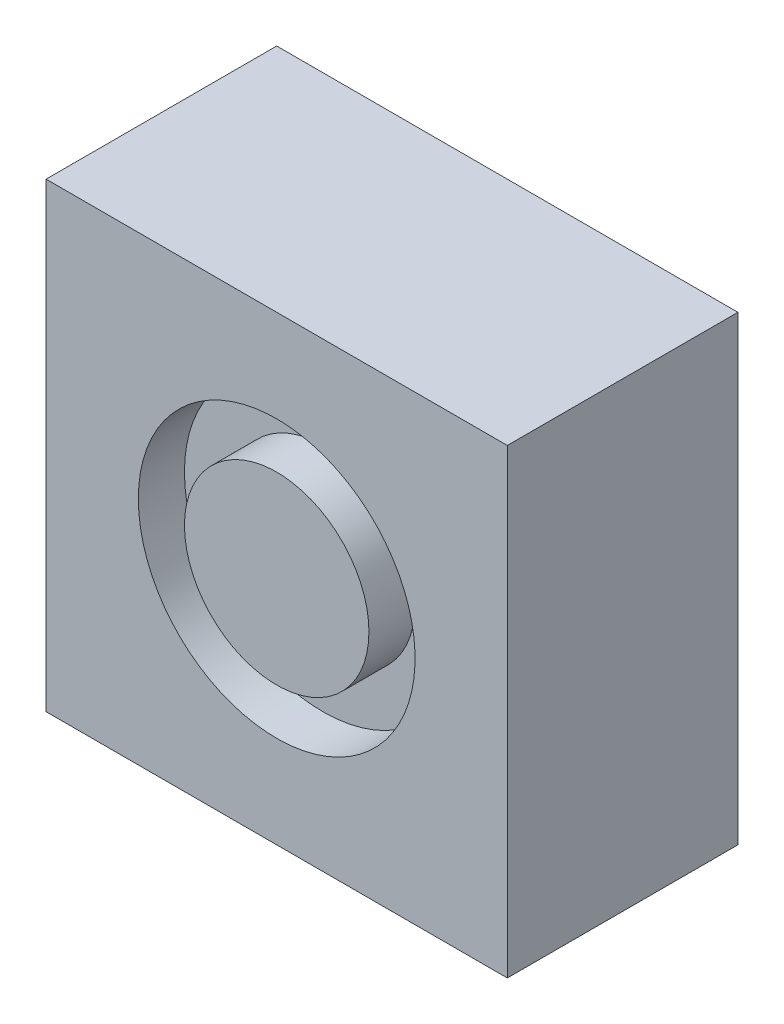
ISO-10303-21;
HEADER;
FILE_DESCRIPTION(('STEP AP214'),'2;1');
FILE_NAME('part.step','',(''),(''),'','','');
FILE_SCHEMA(('AUTOMOTIVE_DESIGN { 1 0 10303 214 1 1 1 1 }'));
ENDSEC;
DATA;
#1=APPLICATION_CONTEXT('core data for automotive mechanical design processes');
#2=APPLICATION_PROTOCOL_DEFINITION('international standard','automotive_design',2000,#1);
#3=PRODUCT_CONTEXT('',#1,'mechanical');
#4=PRODUCT('Part','Part','',(#3));
#5=PRODUCT_RELATED_PRODUCT_CATEGORY('part','',(#4));
#6=PRODUCT_DEFINITION_FORMATION('','',#4);
#7=PRODUCT_DEFINITION_CONTEXT('part definition',#1,'design');
#8=PRODUCT_DEFINITION('design','',#6,#7);
#9=PRODUCT_DEFINITION_SHAPE('','',#8);
#10=(LENGTH_UNIT() NAMED_UNIT(*) SI_UNIT(.MILLI.,.METRE.));
#11=(NAMED_UNIT(*) PLANE_ANGLE_UNIT() SI_UNIT($,.RADIAN.));
#12=(NAMED_UNIT(*) SI_UNIT($,.STERADIAN.) SOLID_ANGLE_UNIT());
#13=UNCERTAINTY_MEASURE_WITH_UNIT(LENGTH_MEASURE(1.E-05),#10,'distance_accuracy_value','');
#14=(GEOMETRIC_REPRESENTATION_CONTEXT(3) GLOBAL_UNCERTAINTY_ASSIGNED_CONTEXT((#13)) GLOBAL_UNIT_ASSIGNED_CONTEXT((#10,
#11,#12)) REPRESENTATION_CONTEXT('',''));
#15=CARTESIAN_POINT('',(0.,0.,0.));
#16=DIRECTION('',(0.,0.,1.));
#17=DIRECTION('',(1.,0.,0.));
#18=AXIS2_PLACEMENT_3D('',#15,#16,#17);
#19=CARTESIAN_POINT('',(0.,0.,50.));
#20=DIRECTION('',(0.,0.,1.));
#21=DIRECTION('',(1.,0.,0.));
#22=AXIS2_PLACEMENT_3D('',#19,#20,#21);
#23=PLANE('',#22);
#24=DIRECTION('',(0.,-1.,0.));
#25=VECTOR('',#24,1.);
#26=CARTESIAN_POINT('',(-50.,-50.,50.));
#27=LINE('',#26,#25);
#28=CARTESIAN_POINT('',(-50.,50.,50.));
#29=VERTEX_POINT('',#28);
#30=CARTESIAN_POINT('',(-50.,-50.,50.));
#31=VERTEX_POINT('',#30);
#32=EDGE_CURVE('E104',#29,#31,#27,.T.);
#33=ORIENTED_EDGE('',*,*,#32,.T.);
#34=DIRECTION('',(1.,0.,0.));
#35=VECTOR('',#34,1.);
#36=CARTESIAN_POINT('',(50.,-50.,50.));
#37=LINE('',#36,#35);
#38=CARTESIAN_POINT('',(50.,-50.,50.));
#39=VERTEX_POINT('',#38);
#40=EDGE_CURVE('E107',#31,#39,#37,.T.);
#41=ORIENTED_EDGE('',*,*,#40,.T.);
#42=DIRECTION('',(0.,1.,0.));
#43=VECTOR('',#42,1.);
#44=CARTESIAN_POINT('',(50.,-50.,50.));
#45=LINE('',#44,#43);
#46=CARTESIAN_POINT('',(50.,50.,50.));
#47=VERTEX_POINT('',#46);
#48=EDGE_CURVE('E110',#39,#47,#45,.T.);
#49=ORIENTED_EDGE('',*,*,#48,.T.);
#50=DIRECTION('',(-1.,0.,0.));
#51=VECTOR('',#50,1.);
#52=CARTESIAN_POINT('',(50.,50.,50.));
#53=LINE('',#52,#51);
#54=EDGE_CURVE('E112',#47,#29,#53,.T.);
#55=ORIENTED_EDGE('',*,*,#54,.T.);
#56=EDGE_LOOP('',(#33,#41,#49,#55));
#57=FACE_BOUND('',#56,.T.);
#58=CARTESIAN_POINT('',(0.,0.,50.));
#59=DIRECTION('',(0.,0.,1.));
#60=DIRECTION('',(1.,0.,0.));
#61=AXIS2_PLACEMENT_3D('',#58,#59,#60);
#62=CIRCLE('',#61,30.);
#63=CARTESIAN_POINT('',(-30.,0.,50.));
#64=VERTEX_POINT('',#63);
#65=EDGE_CURVE('E11',#64,#64,#62,.F.);
#66=ORIENTED_EDGE('',*,*,#65,.T.);
#67=EDGE_LOOP('',(#66));
#68=FACE_BOUND('',#67,.T.);
#69=ADVANCED_FACE('F37',(#57,#68),#23,.T.);
#70=CARTESIAN_POINT('',(-50.,-50.,50.));
#71=DIRECTION('',(1.,0.,0.));
#72=DIRECTION('',(0.,0.,-1.));
#73=AXIS2_PLACEMENT_3D('',#70,#71,#72);
#74=PLANE('',#73);
#75=DIRECTION('',(0.,-1.,0.));
#76=VECTOR('',#75,1.);
#77=CARTESIAN_POINT('',(-50.,-50.,0.));
#78=LINE('',#77,#76);
#79=CARTESIAN_POINT('',(-50.,50.,0.));
#80=VERTEX_POINT('',#79);
#81=CARTESIAN_POINT('',(-50.,-50.,0.));
#82=VERTEX_POINT('',#81);
#83=EDGE_CURVE('E99',#80,#82,#78,.T.);
#84=ORIENTED_EDGE('',*,*,#83,.T.);
#85=DIRECTION('',(0.,0.,-1.));
#86=VECTOR('',#85,1.);
#87=CARTESIAN_POINT('',(-50.,-50.,50.));
#88=LINE('',#87,#86);
#89=EDGE_CURVE('E130',#31,#82,#88,.T.);
#90=ORIENTED_EDGE('',*,*,#89,.F.);
#91=ORIENTED_EDGE('',*,*,#32,.F.);
#92=DIRECTION('',(0.,0.,-1.));
#93=VECTOR('',#92,1.);
#94=CARTESIAN_POINT('',(-50.,50.,50.));
#95=LINE('',#94,#93);
#96=EDGE_CURVE('E114',#29,#80,#95,.T.);
#97=ORIENTED_EDGE('',*,*,#96,.T.);
#98=EDGE_LOOP('',(#84,#90,#91,#97));
#99=FACE_BOUND('',#98,.T.);
#100=ADVANCED_FACE('F39',(#99),#74,.F.);
#101=CARTESIAN_POINT('',(50.,-50.,50.));
#102=DIRECTION('',(0.,1.,0.));
#103=DIRECTION('',(-1.,0.,0.));
#104=AXIS2_PLACEMENT_3D('',#101,#102,#103);
#105=PLANE('',#104);
#106=DIRECTION('',(1.,0.,0.));
#107=VECTOR('',#106,1.);
#108=CARTESIAN_POINT('',(50.,-50.,0.));
#109=LINE('',#108,#107);
#110=CARTESIAN_POINT('',(50.,-50.,0.));
#111=VERTEX_POINT('',#110);
#112=EDGE_CURVE('E117',#82,#111,#109,.T.);
#113=ORIENTED_EDGE('',*,*,#112,.T.);
#114=DIRECTION('',(0.,0.,-1.));
#115=VECTOR('',#114,1.);
#116=CARTESIAN_POINT('',(50.,-50.,50.));
#117=LINE('',#116,#115);
#118=EDGE_CURVE('E127',#39,#111,#117,.T.);
#119=ORIENTED_EDGE('',*,*,#118,.F.);
#120=ORIENTED_EDGE('',*,*,#40,.F.);
#121=ORIENTED_EDGE('',*,*,#89,.T.);
#122=EDGE_LOOP('',(#113,#119,#120,#121));
#123=FACE_BOUND('',#122,.T.);
#124=ADVANCED_FACE('F151',(#123),#105,.F.);
#125=CARTESIAN_POINT('',(50.,-50.,50.));
#126=DIRECTION('',(-1.,0.,0.));
#127=DIRECTION('',(0.,0.,1.));
#128=AXIS2_PLACEMENT_3D('',#125,#126,#127);
#129=PLANE('',#128);
#130=DIRECTION('',(0.,1.,0.));
#131=VECTOR('',#130,1.);
#132=CARTESIAN_POINT('',(50.,-50.,0.));
#133=LINE('',#132,#131);
#134=CARTESIAN_POINT('',(50.,50.,0.));
#135=VERTEX_POINT('',#134);
#136=EDGE_CURVE('E119',#111,#135,#133,.T.);
#137=ORIENTED_EDGE('',*,*,#136,.T.);
#138=DIRECTION('',(0.,0.,-1.));
#139=VECTOR('',#138,1.);
#140=CARTESIAN_POINT('',(50.,50.,50.));
#141=LINE('',#140,#139);
#142=EDGE_CURVE('E124',#47,#135,#141,.T.);
#143=ORIENTED_EDGE('',*,*,#142,.F.);
#144=ORIENTED_EDGE('',*,*,#48,.F.);
#145=ORIENTED_EDGE('',*,*,#118,.T.);
#146=EDGE_LOOP('',(#137,#143,#144,#145));
#147=FACE_BOUND('',#146,.T.);
#148=ADVANCED_FACE('F194',(#147),#129,.F.);
#149=CARTESIAN_POINT('',(50.,50.,50.));
#150=DIRECTION('',(0.,-1.,0.));
#151=DIRECTION('',(1.,0.,0.));
#152=AXIS2_PLACEMENT_3D('',#149,#150,#151);
#153=PLANE('',#152);
#154=DIRECTION('',(-1.,0.,0.));
#155=VECTOR('',#154,1.);
#156=CARTESIAN_POINT('',(50.,50.,0.));
#157=LINE('',#156,#155);
#158=EDGE_CURVE('E108',#135,#80,#157,.T.);
#159=ORIENTED_EDGE('',*,*,#158,.T.);
#160=ORIENTED_EDGE('',*,*,#96,.F.);
#161=ORIENTED_EDGE('',*,*,#54,.F.);
#162=ORIENTED_EDGE('',*,*,#142,.T.);
#163=EDGE_LOOP('',(#159,#160,#161,#162));
#164=FACE_BOUND('',#163,.T.);
#165=ADVANCED_FACE('F185',(#164),#153,.F.);
#166=CARTESIAN_POINT('',(0.,0.,0.));
#167=DIRECTION('',(0.,0.,1.));
#168=DIRECTION('',(1.,0.,0.));
#169=AXIS2_PLACEMENT_3D('',#166,#167,#168);
#170=PLANE('',#169);
#171=ORIENTED_EDGE('',*,*,#83,.F.);
#172=ORIENTED_EDGE('',*,*,#158,.F.);
#173=ORIENTED_EDGE('',*,*,#136,.F.);
#174=ORIENTED_EDGE('',*,*,#112,.F.);
#175=EDGE_LOOP('',(#171,#172,#173,#174));
#176=FACE_BOUND('',#175,.T.);
#177=ADVANCED_FACE('F143',(#176),#170,.F.);
#178=CARTESIAN_POINT('',(0.,0.,50.));
#179=DIRECTION('',(0.,0.,1.));
#180=DIRECTION('',(1.,0.,0.));
#181=AXIS2_PLACEMENT_3D('',#178,#179,#180);
#182=CYLINDRICAL_SURFACE('',#181,30.);
#183=DIRECTION('',(0.,0.,1.));
#184=VECTOR('',#183,1.);
#185=CARTESIAN_POINT('',(-30.,0.,40.));
#186=LINE('',#185,#184);
#187=CARTESIAN_POINT('',(-30.,0.,40.));
#188=VERTEX_POINT('',#187);
#189=EDGE_CURVE('E52',#188,#64,#186,.T.);
#190=ORIENTED_EDGE('',*,*,#189,.F.);
#191=CARTESIAN_POINT('',(0.,0.,40.));
#192=DIRECTION('',(0.,0.,1.));
#193=DIRECTION('',(-1.,0.,0.));
#194=AXIS2_PLACEMENT_3D('',#191,#192,#193);
#195=CIRCLE('',#194,30.);
#196=EDGE_CURVE('E89',#188,#188,#195,.T.);
#197=ORIENTED_EDGE('',*,*,#196,.F.);
#198=ORIENTED_EDGE('',*,*,#189,.T.);
#199=ORIENTED_EDGE('',*,*,#65,.F.);
#200=EDGE_LOOP('',(#190,#197,#198,#199));
#201=FACE_BOUND('',#200,.T.);
#202=ADVANCED_FACE('F88',(#201),#182,.F.);
#203=CARTESIAN_POINT('',(0.,0.,50.));
#204=DIRECTION('',(0.,0.,1.));
#205=DIRECTION('',(1.,0.,0.));
#206=AXIS2_PLACEMENT_3D('',#203,#204,#205);
#207=CYLINDRICAL_SURFACE('',#206,20.);
#208=DIRECTION('',(0.,0.,-1.));
#209=VECTOR('',#208,1.);
#210=CARTESIAN_POINT('',(-20.,0.,40.));
#211=LINE('',#210,#209);
#212=CARTESIAN_POINT('',(-20.,0.,50.));
#213=VERTEX_POINT('',#212);
#214=CARTESIAN_POINT('',(-20.,0.,40.));
#215=VERTEX_POINT('',#214);
#216=EDGE_CURVE('E59',#213,#215,#211,.T.);
#217=ORIENTED_EDGE('',*,*,#216,.T.);
#218=CARTESIAN_POINT('',(0.,0.,40.));
#219=DIRECTION('',(0.,0.,1.));
#220=DIRECTION('',(-1.,0.,0.));
#221=AXIS2_PLACEMENT_3D('',#218,#219,#220);
#222=CIRCLE('',#221,20.);
#223=EDGE_CURVE('E97',#215,#215,#222,.T.);
#224=ORIENTED_EDGE('',*,*,#223,.T.);
#225=ORIENTED_EDGE('',*,*,#216,.F.);
#226=CARTESIAN_POINT('',(0.,0.,50.));
#227=DIRECTION('',(0.,0.,1.));
#228=DIRECTION('',(1.,0.,0.));
#229=AXIS2_PLACEMENT_3D('',#226,#227,#228);
#230=CIRCLE('',#229,20.);
#231=EDGE_CURVE('E45',#213,#213,#230,.T.);
#232=ORIENTED_EDGE('',*,*,#231,.F.);
#233=EDGE_LOOP('',(#217,#224,#225,#232));
#234=FACE_BOUND('',#233,.T.);
#235=ADVANCED_FACE('F135',(#234),#207,.T.);
#236=CARTESIAN_POINT('',(-20.,0.,40.));
#237=DIRECTION('',(0.,0.,1.));
#238=DIRECTION('',(1.,0.,0.));
#239=AXIS2_PLACEMENT_3D('',#236,#237,#238);
#240=PLANE('',#239);
#241=ORIENTED_EDGE('',*,*,#196,.T.);
#242=EDGE_LOOP('',(#241));
#243=FACE_BOUND('',#242,.T.);
#244=ORIENTED_EDGE('',*,*,#223,.F.);
#245=EDGE_LOOP('',(#244));
#246=FACE_BOUND('',#245,.T.);
#247=ADVANCED_FACE('F94',(#243,#246),#240,.T.);
#248=ORIENTED_EDGE('',*,*,#231,.T.);
#249=EDGE_LOOP('',(#248));
#250=FACE_BOUND('',#249,.T.);
#251=ADVANCED_FACE('F134',(#250),#23,.T.);
#252=CLOSED_SHELL('',(#69,#100,#124,#148,#165,#177,#202,#235,#247,#251));
#253=MANIFOLD_SOLID_BREP('B2',#252);
#254=ADVANCED_BREP_SHAPE_REPRESENTATION('',(#18,#253),#14);
#255=SHAPE_DEFINITION_REPRESENTATION(#9,#254);
ENDSEC;
END-ISO-10303-21;
